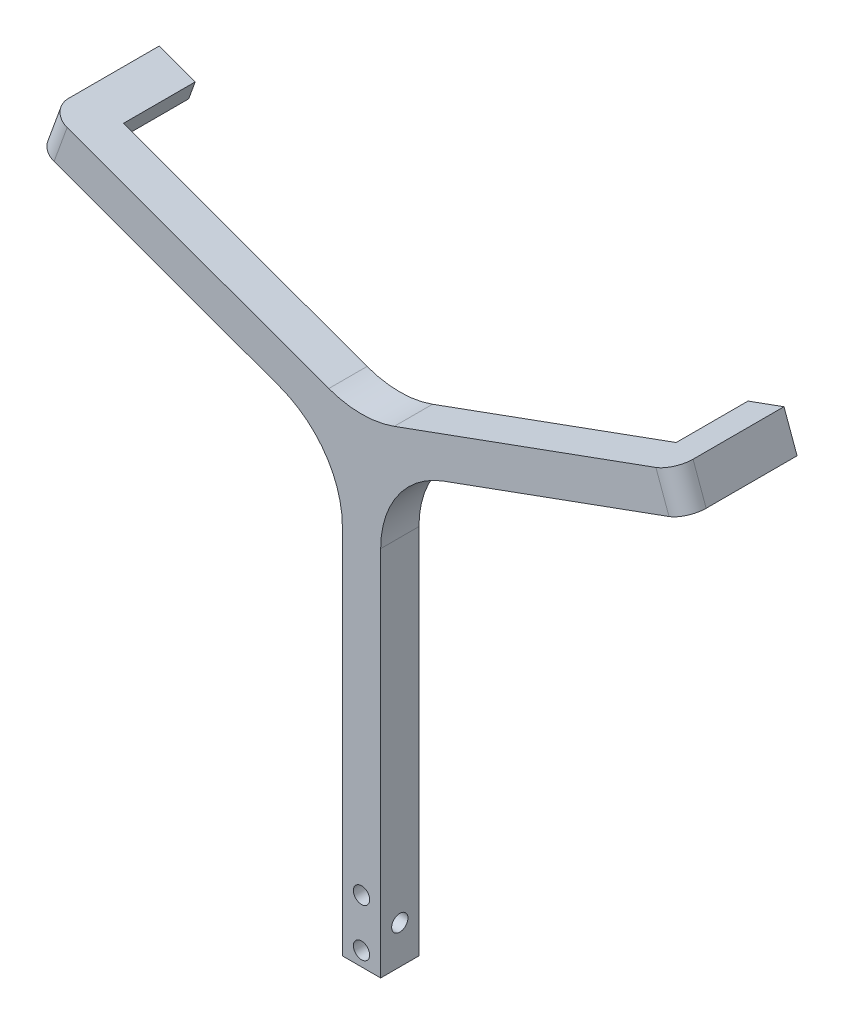
ISO-10303-21;
HEADER;
FILE_DESCRIPTION(('STEP AP214'),'2;1');
FILE_NAME('part.step','',(''),(''),'','','');
FILE_SCHEMA(('AUTOMOTIVE_DESIGN { 1 0 10303 214 1 1 1 1 }'));
ENDSEC;
DATA;
#1=APPLICATION_CONTEXT('core data for automotive mechanical design processes');
#2=APPLICATION_PROTOCOL_DEFINITION('international standard','automotive_design',2000,#1);
#3=PRODUCT_CONTEXT('',#1,'mechanical');
#4=PRODUCT('Part','Part','',(#3));
#5=PRODUCT_RELATED_PRODUCT_CATEGORY('part','',(#4));
#6=PRODUCT_DEFINITION_FORMATION('','',#4);
#7=PRODUCT_DEFINITION_CONTEXT('part definition',#1,'design');
#8=PRODUCT_DEFINITION('design','',#6,#7);
#9=PRODUCT_DEFINITION_SHAPE('','',#8);
#10=(LENGTH_UNIT() NAMED_UNIT(*) SI_UNIT(.MILLI.,.METRE.));
#11=(NAMED_UNIT(*) PLANE_ANGLE_UNIT() SI_UNIT($,.RADIAN.));
#12=(NAMED_UNIT(*) SI_UNIT($,.STERADIAN.) SOLID_ANGLE_UNIT());
#13=UNCERTAINTY_MEASURE_WITH_UNIT(LENGTH_MEASURE(1.E-05),#10,'distance_accuracy_value','');
#14=(GEOMETRIC_REPRESENTATION_CONTEXT(3) GLOBAL_UNCERTAINTY_ASSIGNED_CONTEXT((#13)) GLOBAL_UNIT_ASSIGNED_CONTEXT((#10,
#11,#12)) REPRESENTATION_CONTEXT('',''));
#15=CARTESIAN_POINT('',(0.,0.,0.));
#16=DIRECTION('',(0.,0.,1.));
#17=DIRECTION('',(1.,0.,0.));
#18=AXIS2_PLACEMENT_3D('',#15,#16,#17);
#19=CARTESIAN_POINT('',(0.,0.,0.));
#20=DIRECTION('',(0.,0.,-1.));
#21=DIRECTION('',(-1.,0.,0.));
#22=AXIS2_PLACEMENT_3D('',#19,#20,#21);
#23=PLANE('',#22);
#24=CARTESIAN_POINT('',(68.,45.5,0.));
#25=DIRECTION('',(0.,0.,-1.));
#26=DIRECTION('',(-1.,0.,0.));
#27=AXIS2_PLACEMENT_3D('',#24,#25,#26);
#28=CIRCLE('',#27,1.69999999999999);
#29=CARTESIAN_POINT('',(66.3,45.5,0.));
#30=VERTEX_POINT('',#29);
#31=EDGE_CURVE('E646',#30,#30,#28,.T.);
#32=ORIENTED_EDGE('',*,*,#31,.F.);
#33=EDGE_LOOP('',(#32));
#34=FACE_BOUND('',#33,.T.);
#35=CARTESIAN_POINT('',(68.,35.5,0.));
#36=DIRECTION('',(0.,0.,-1.));
#37=DIRECTION('',(-1.,0.,0.));
#38=AXIS2_PLACEMENT_3D('',#35,#36,#37);
#39=CIRCLE('',#38,1.69999999999999);
#40=CARTESIAN_POINT('',(66.3,35.5,0.));
#41=VERTEX_POINT('',#40);
#42=EDGE_CURVE('E652',#41,#41,#39,.T.);
#43=ORIENTED_EDGE('',*,*,#42,.F.);
#44=EDGE_LOOP('',(#43));
#45=FACE_BOUND('',#44,.T.);
#46=DIRECTION('',(0.,1.,0.));
#47=VECTOR('',#46,1.);
#48=CARTESIAN_POINT('',(72.,124.188364040676,0.));
#49=LINE('',#48,#47);
#50=CARTESIAN_POINT('',(72.,32.5,0.));
#51=VERTEX_POINT('',#50);
#52=CARTESIAN_POINT('',(72.,110.184213276482,0.));
#53=VERTEX_POINT('',#52);
#54=EDGE_CURVE('E195',#51,#53,#49,.T.);
#55=ORIENTED_EDGE('',*,*,#54,.F.);
#56=DIRECTION('',(-1.,0.,0.));
#57=VECTOR('',#56,1.);
#58=CARTESIAN_POINT('',(0.,32.5,0.));
#59=LINE('',#58,#57);
#60=CARTESIAN_POINT('',(64.,32.5,0.));
#61=VERTEX_POINT('',#60);
#62=EDGE_CURVE('E180',#51,#61,#59,.T.);
#63=ORIENTED_EDGE('',*,*,#62,.T.);
#64=DIRECTION('',(0.,-1.,0.));
#65=VECTOR('',#64,1.);
#66=CARTESIAN_POINT('',(64.,0.,0.));
#67=LINE('',#66,#65);
#68=CARTESIAN_POINT('',(64.0000000000001,110.184213276482,0.));
#69=VERTEX_POINT('',#68);
#70=EDGE_CURVE('E228',#69,#61,#67,.T.);
#71=ORIENTED_EDGE('',*,*,#70,.F.);
#72=CARTESIAN_POINT('',(44.0000000000001,110.184213276482,0.));
#73=DIRECTION('',(0.,0.,-1.));
#74=DIRECTION('',(-1.,0.,0.));
#75=AXIS2_PLACEMENT_3D('',#72,#73,#74);
#76=CIRCLE('',#75,20.);
#77=CARTESIAN_POINT('',(50.8404028665134,128.9780656922,0.));
#78=VERTEX_POINT('',#77);
#79=EDGE_CURVE('E271',#69,#78,#76,.F.);
#80=ORIENTED_EDGE('',*,*,#79,.T.);
#81=DIRECTION('',(0.939692620785909,-0.342020143325666,0.));
#82=VECTOR('',#81,1.);
#83=CARTESIAN_POINT('',(64.0000000000001,124.188364040676,0.));
#84=LINE('',#83,#82);
#85=CARTESIAN_POINT('',(3.75877048314365,146.11437846041,0.));
#86=VERTEX_POINT('',#85);
#87=EDGE_CURVE('E224',#86,#78,#84,.T.);
#88=ORIENTED_EDGE('',*,*,#87,.F.);
#89=DIRECTION('',(-0.906307787036649,-0.422618261740702,0.));
#90=VECTOR('',#89,1.);
#91=CARTESIAN_POINT('',(8.88562153958992,148.505068370251,0.));
#92=LINE('',#91,#90);
#93=CARTESIAN_POINT('',(8.88562153958992,148.505068370251,0.));
#94=VERTEX_POINT('',#93);
#95=EDGE_CURVE('E189',#94,#86,#92,.T.);
#96=ORIENTED_EDGE('',*,*,#95,.F.);
#97=DIRECTION('',(-0.342020143325668,-0.939692620785909,0.));
#98=VECTOR('',#97,1.);
#99=CARTESIAN_POINT('',(10.2537021128926,152.263838853395,0.));
#100=LINE('',#99,#98);
#101=CARTESIAN_POINT('',(10.2537021128926,152.263838853395,0.));
#102=VERTEX_POINT('',#101);
#103=EDGE_CURVE('E350',#102,#94,#100,.T.);
#104=ORIENTED_EDGE('',*,*,#103,.F.);
#105=DIRECTION('',(-0.939692620785908,0.342020143325669,0.));
#106=VECTOR('',#105,1.);
#107=CARTESIAN_POINT('',(2.73616114660533,155.,0.));
#108=LINE('',#107,#106);
#109=CARTESIAN_POINT('',(61.1595971334866,133.735608317218,0.));
#110=VERTEX_POINT('',#109);
#111=EDGE_CURVE('E221',#110,#102,#108,.T.);
#112=ORIENTED_EDGE('',*,*,#111,.F.);
#113=CARTESIAN_POINT('',(68.,152.529460732936,0.));
#114=DIRECTION('',(0.,0.,-1.));
#115=DIRECTION('',(-1.,0.,0.));
#116=AXIS2_PLACEMENT_3D('',#113,#114,#115);
#117=CIRCLE('',#116,20.);
#118=CARTESIAN_POINT('',(74.8404028665134,133.735608317218,0.));
#119=VERTEX_POINT('',#118);
#120=EDGE_CURVE('E277',#110,#119,#117,.F.);
#121=ORIENTED_EDGE('',*,*,#120,.T.);
#122=DIRECTION('',(-0.939692620785908,-0.34202014332567,0.));
#123=VECTOR('',#122,1.);
#124=CARTESIAN_POINT('',(68.,131.245905283418,0.));
#125=LINE('',#124,#123);
#126=CARTESIAN_POINT('',(125.746297887107,152.263838853395,0.));
#127=VERTEX_POINT('',#126);
#128=EDGE_CURVE('E209',#127,#119,#125,.T.);
#129=ORIENTED_EDGE('',*,*,#128,.F.);
#130=DIRECTION('',(-0.342020143325667,0.939692620785909,0.));
#131=VECTOR('',#130,1.);
#132=CARTESIAN_POINT('',(127.11437846041,148.505068370251,0.));
#133=LINE('',#132,#131);
#134=CARTESIAN_POINT('',(127.11437846041,148.505068370251,0.));
#135=VERTEX_POINT('',#134);
#136=EDGE_CURVE('E369',#135,#127,#133,.T.);
#137=ORIENTED_EDGE('',*,*,#136,.F.);
#138=DIRECTION('',(-0.906307787036652,0.422618261740695,0.));
#139=VECTOR('',#138,1.);
#140=CARTESIAN_POINT('',(132.241229516856,146.11437846041,0.));
#141=LINE('',#140,#139);
#142=CARTESIAN_POINT('',(132.241229516856,146.11437846041,0.));
#143=VERTEX_POINT('',#142);
#144=EDGE_CURVE('E363',#143,#135,#141,.T.);
#145=ORIENTED_EDGE('',*,*,#144,.F.);
#146=DIRECTION('',(0.939692620785909,0.342020143325666,0.));
#147=VECTOR('',#146,1.);
#148=CARTESIAN_POINT('',(136.,147.482459033713,0.));
#149=LINE('',#148,#147);
#150=CARTESIAN_POINT('',(85.1595971334866,128.9780656922,0.));
#151=VERTEX_POINT('',#150);
#152=EDGE_CURVE('E204',#151,#143,#149,.T.);
#153=ORIENTED_EDGE('',*,*,#152,.F.);
#154=CARTESIAN_POINT('',(92.,110.184213276482,0.));
#155=DIRECTION('',(0.,0.,-1.));
#156=DIRECTION('',(-1.,0.,0.));
#157=AXIS2_PLACEMENT_3D('',#154,#155,#156);
#158=CIRCLE('',#157,20.);
#159=EDGE_CURVE('E201',#151,#53,#158,.F.);
#160=ORIENTED_EDGE('',*,*,#159,.T.);
#161=EDGE_LOOP('',(#55,#63,#71,#80,#88,#96,#104,#112,#121,#129,#137,#145,#153,#160));
#162=FACE_BOUND('',#161,.T.);
#163=ADVANCED_FACE('F43',(#34,#45,#162),#23,.T.);
#164=CARTESIAN_POINT('',(72.,124.188364040676,8.));
#165=DIRECTION('',(-1.,0.,0.));
#166=DIRECTION('',(0.,-1.,0.));
#167=AXIS2_PLACEMENT_3D('',#164,#165,#166);
#168=PLANE('',#167);
#169=CARTESIAN_POINT('',(72.,40.5,4.));
#170=DIRECTION('',(-1.,0.,0.));
#171=DIRECTION('',(0.,-1.,0.));
#172=AXIS2_PLACEMENT_3D('',#169,#170,#171);
#173=CIRCLE('',#172,1.69999999999999);
#174=CARTESIAN_POINT('',(72.,38.8,4.));
#175=VERTEX_POINT('',#174);
#176=EDGE_CURVE('E664',#175,#175,#173,.T.);
#177=ORIENTED_EDGE('',*,*,#176,.T.);
#178=EDGE_LOOP('',(#177));
#179=FACE_BOUND('',#178,.T.);
#180=DIRECTION('',(0.,0.,1.));
#181=VECTOR('',#180,1.);
#182=CARTESIAN_POINT('',(72.,32.5,11.5));
#183=LINE('',#182,#181);
#184=CARTESIAN_POINT('',(72.,32.5,8.));
#185=VERTEX_POINT('',#184);
#186=EDGE_CURVE('E59',#51,#185,#183,.T.);
#187=ORIENTED_EDGE('',*,*,#186,.F.);
#188=ORIENTED_EDGE('',*,*,#54,.T.);
#189=DIRECTION('',(0.,0.,-1.));
#190=VECTOR('',#189,1.);
#191=CARTESIAN_POINT('',(72.,110.184213276482,8.));
#192=LINE('',#191,#190);
#193=CARTESIAN_POINT('',(72.,110.184213276482,8.));
#194=VERTEX_POINT('',#193);
#195=EDGE_CURVE('E247',#53,#194,#192,.F.);
#196=ORIENTED_EDGE('',*,*,#195,.T.);
#197=DIRECTION('',(0.,1.,0.));
#198=VECTOR('',#197,1.);
#199=CARTESIAN_POINT('',(72.,124.188364040676,8.));
#200=LINE('',#199,#198);
#201=EDGE_CURVE('E197',#185,#194,#200,.T.);
#202=ORIENTED_EDGE('',*,*,#201,.F.);
#203=EDGE_LOOP('',(#187,#188,#196,#202));
#204=FACE_BOUND('',#203,.T.);
#205=ADVANCED_FACE('F193',(#179,#204),#168,.F.);
#206=CARTESIAN_POINT('',(64.,0.,8.));
#207=DIRECTION('',(1.,0.,0.));
#208=DIRECTION('',(0.,1.,0.));
#209=AXIS2_PLACEMENT_3D('',#206,#207,#208);
#210=PLANE('',#209);
#211=CARTESIAN_POINT('',(64.,40.5,4.));
#212=DIRECTION('',(-1.,0.,0.));
#213=DIRECTION('',(0.,0.,1.));
#214=AXIS2_PLACEMENT_3D('',#211,#212,#213);
#215=CIRCLE('',#214,1.69999999999999);
#216=CARTESIAN_POINT('',(64.,40.5,5.69999999999999));
#217=VERTEX_POINT('',#216);
#218=EDGE_CURVE('E660',#217,#217,#215,.T.);
#219=ORIENTED_EDGE('',*,*,#218,.F.);
#220=EDGE_LOOP('',(#219));
#221=FACE_BOUND('',#220,.T.);
#222=DIRECTION('',(0.,0.,-1.));
#223=VECTOR('',#222,1.);
#224=CARTESIAN_POINT('',(64.,32.5,11.5));
#225=LINE('',#224,#223);
#226=CARTESIAN_POINT('',(64.,32.5,8.));
#227=VERTEX_POINT('',#226);
#228=EDGE_CURVE('E183',#227,#61,#225,.T.);
#229=ORIENTED_EDGE('',*,*,#228,.F.);
#230=DIRECTION('',(0.,-1.,0.));
#231=VECTOR('',#230,1.);
#232=CARTESIAN_POINT('',(64.,0.,8.));
#233=LINE('',#232,#231);
#234=CARTESIAN_POINT('',(64.0000000000001,110.184213276482,8.));
#235=VERTEX_POINT('',#234);
#236=EDGE_CURVE('E215',#235,#227,#233,.T.);
#237=ORIENTED_EDGE('',*,*,#236,.F.);
#238=DIRECTION('',(0.,0.,-1.));
#239=VECTOR('',#238,1.);
#240=CARTESIAN_POINT('',(64.0000000000001,110.184213276482,0.));
#241=LINE('',#240,#239);
#242=EDGE_CURVE('E250',#235,#69,#241,.T.);
#243=ORIENTED_EDGE('',*,*,#242,.T.);
#244=ORIENTED_EDGE('',*,*,#70,.T.);
#245=EDGE_LOOP('',(#229,#237,#243,#244));
#246=FACE_BOUND('',#245,.T.);
#247=ADVANCED_FACE('F409',(#221,#246),#210,.F.);
#248=CARTESIAN_POINT('',(0.,0.,8.));
#249=DIRECTION('',(0.,0.,-1.));
#250=DIRECTION('',(-1.,0.,0.));
#251=AXIS2_PLACEMENT_3D('',#248,#249,#250);
#252=PLANE('',#251);
#253=CARTESIAN_POINT('',(68.,45.5,8.));
#254=DIRECTION('',(0.,0.,-1.));
#255=DIRECTION('',(-1.,0.,0.));
#256=AXIS2_PLACEMENT_3D('',#253,#254,#255);
#257=CIRCLE('',#256,1.69999999999999);
#258=CARTESIAN_POINT('',(66.3,45.5,8.));
#259=VERTEX_POINT('',#258);
#260=EDGE_CURVE('E649',#259,#259,#257,.T.);
#261=ORIENTED_EDGE('',*,*,#260,.T.);
#262=EDGE_LOOP('',(#261));
#263=FACE_BOUND('',#262,.T.);
#264=CARTESIAN_POINT('',(68.,35.5,8.));
#265=DIRECTION('',(0.,0.,-1.));
#266=DIRECTION('',(-1.,0.,0.));
#267=AXIS2_PLACEMENT_3D('',#264,#265,#266);
#268=CIRCLE('',#267,1.69999999999999);
#269=CARTESIAN_POINT('',(66.3,35.5,8.));
#270=VERTEX_POINT('',#269);
#271=EDGE_CURVE('E47',#270,#270,#268,.T.);
#272=ORIENTED_EDGE('',*,*,#271,.T.);
#273=EDGE_LOOP('',(#272));
#274=FACE_BOUND('',#273,.T.);
#275=DIRECTION('',(-1.,0.,0.));
#276=VECTOR('',#275,1.);
#277=CARTESIAN_POINT('',(0.,32.5,8.));
#278=LINE('',#277,#276);
#279=EDGE_CURVE('E11',#185,#227,#278,.T.);
#280=ORIENTED_EDGE('',*,*,#279,.F.);
#281=ORIENTED_EDGE('',*,*,#201,.T.);
#282=CARTESIAN_POINT('',(92.,110.184213276482,8.));
#283=DIRECTION('',(0.,0.,-1.));
#284=DIRECTION('',(-1.,0.,0.));
#285=AXIS2_PLACEMENT_3D('',#282,#283,#284);
#286=CIRCLE('',#285,20.);
#287=CARTESIAN_POINT('',(85.1595971334866,128.9780656922,8.));
#288=VERTEX_POINT('',#287);
#289=EDGE_CURVE('E268',#194,#288,#286,.T.);
#290=ORIENTED_EDGE('',*,*,#289,.T.);
#291=DIRECTION('',(0.939692620785909,0.342020143325666,0.));
#292=VECTOR('',#291,1.);
#293=CARTESIAN_POINT('',(136.,147.482459033713,8.));
#294=LINE('',#293,#292);
#295=CARTESIAN_POINT('',(132.241229516856,146.11437846041,8.));
#296=VERTEX_POINT('',#295);
#297=EDGE_CURVE('E397',#288,#296,#294,.T.);
#298=ORIENTED_EDGE('',*,*,#297,.T.);
#299=DIRECTION('',(-0.342020143325668,0.939692620785909,0.));
#300=VECTOR('',#299,1.);
#301=CARTESIAN_POINT('',(163.732200305433,59.5936473020893,8.));
#302=LINE('',#301,#300);
#303=CARTESIAN_POINT('',(129.505068370251,153.631919426697,8.));
#304=VERTEX_POINT('',#303);
#305=EDGE_CURVE('E287',#296,#304,#302,.T.);
#306=ORIENTED_EDGE('',*,*,#305,.T.);
#307=DIRECTION('',(-0.939692620785908,-0.34202014332567,0.));
#308=VECTOR('',#307,1.);
#309=CARTESIAN_POINT('',(68.,131.245905283418,8.));
#310=LINE('',#309,#308);
#311=CARTESIAN_POINT('',(74.8404028665134,133.735608317218,8.));
#312=VERTEX_POINT('',#311);
#313=EDGE_CURVE('E322',#304,#312,#310,.T.);
#314=ORIENTED_EDGE('',*,*,#313,.T.);
#315=CARTESIAN_POINT('',(68.,152.529460732936,8.));
#316=DIRECTION('',(0.,0.,-1.));
#317=DIRECTION('',(-1.,0.,0.));
#318=AXIS2_PLACEMENT_3D('',#315,#316,#317);
#319=CIRCLE('',#318,20.);
#320=CARTESIAN_POINT('',(61.1595971334866,133.735608317218,8.));
#321=VERTEX_POINT('',#320);
#322=EDGE_CURVE('E280',#312,#321,#319,.T.);
#323=ORIENTED_EDGE('',*,*,#322,.T.);
#324=DIRECTION('',(-0.939692620785908,0.342020143325669,0.));
#325=VECTOR('',#324,1.);
#326=CARTESIAN_POINT('',(2.73616114660533,155.,8.));
#327=LINE('',#326,#325);
#328=CARTESIAN_POINT('',(6.49493162974896,153.631919426697,8.));
#329=VERTEX_POINT('',#328);
#330=EDGE_CURVE('E311',#321,#329,#327,.T.);
#331=ORIENTED_EDGE('',*,*,#330,.T.);
#332=DIRECTION('',(-0.342020143325666,-0.939692620785909,0.));
#333=VECTOR('',#332,1.);
#334=CARTESIAN_POINT('',(-43.6411781733426,15.8840898434045,8.));
#335=LINE('',#334,#333);
#336=CARTESIAN_POINT('',(3.75877048314362,146.11437846041,8.));
#337=VERTEX_POINT('',#336);
#338=EDGE_CURVE('E283',#329,#337,#335,.T.);
#339=ORIENTED_EDGE('',*,*,#338,.T.);
#340=DIRECTION('',(0.939692620785909,-0.342020143325666,0.));
#341=VECTOR('',#340,1.);
#342=CARTESIAN_POINT('',(64.0000000000001,124.188364040676,8.));
#343=LINE('',#342,#341);
#344=CARTESIAN_POINT('',(50.8404028665134,128.9780656922,8.));
#345=VERTEX_POINT('',#344);
#346=EDGE_CURVE('E321',#337,#345,#343,.T.);
#347=ORIENTED_EDGE('',*,*,#346,.T.);
#348=CARTESIAN_POINT('',(44.0000000000001,110.184213276482,8.));
#349=DIRECTION('',(0.,0.,-1.));
#350=DIRECTION('',(-1.,0.,0.));
#351=AXIS2_PLACEMENT_3D('',#348,#349,#350);
#352=CIRCLE('',#351,20.);
#353=EDGE_CURVE('E274',#345,#235,#352,.T.);
#354=ORIENTED_EDGE('',*,*,#353,.T.);
#355=ORIENTED_EDGE('',*,*,#236,.T.);
#356=EDGE_LOOP('',(#280,#281,#290,#298,#306,#314,#323,#331,#339,#347,#354,#355));
#357=FACE_BOUND('',#356,.T.);
#358=ADVANCED_FACE('F317',(#263,#274,#357),#252,.F.);
#359=CARTESIAN_POINT('',(136.,147.482459033713,8.));
#360=DIRECTION('',(-0.342020143325666,0.939692620785909,0.));
#361=DIRECTION('',(-0.939692620785909,-0.342020143325666,0.));
#362=AXIS2_PLACEMENT_3D('',#359,#360,#361);
#363=PLANE('',#362);
#364=DIRECTION('',(0.,0.,-1.));
#365=VECTOR('',#364,1.);
#366=CARTESIAN_POINT('',(136.,147.482459033713,8.));
#367=LINE('',#366,#365);
#368=CARTESIAN_POINT('',(136.,147.482459033713,4.));
#369=VERTEX_POINT('',#368);
#370=CARTESIAN_POINT('',(136.,147.482459033713,-15.));
#371=VERTEX_POINT('',#370);
#372=EDGE_CURVE('E240',#369,#371,#367,.T.);
#373=ORIENTED_EDGE('',*,*,#372,.F.);
#374=CARTESIAN_POINT('',(132.241229516856,146.11437846041,4.));
#375=DIRECTION('',(-0.342020143325666,0.939692620785909,0.));
#376=DIRECTION('',(-0.939692620785909,-0.342020143325666,0.));
#377=AXIS2_PLACEMENT_3D('',#374,#375,#376);
#378=CIRCLE('',#377,4.);
#379=EDGE_CURVE('E297',#369,#296,#378,.F.);
#380=ORIENTED_EDGE('',*,*,#379,.T.);
#381=ORIENTED_EDGE('',*,*,#297,.F.);
#382=DIRECTION('',(0.,0.,-1.));
#383=VECTOR('',#382,1.);
#384=CARTESIAN_POINT('',(85.1595971334866,128.9780656922,0.));
#385=LINE('',#384,#383);
#386=EDGE_CURVE('E243',#288,#151,#385,.T.);
#387=ORIENTED_EDGE('',*,*,#386,.T.);
#388=ORIENTED_EDGE('',*,*,#152,.T.);
#389=DIRECTION('',(0.,0.,1.));
#390=VECTOR('',#389,1.);
#391=CARTESIAN_POINT('',(132.241229516856,146.11437846041,-15.));
#392=LINE('',#391,#390);
#393=CARTESIAN_POINT('',(132.241229516856,146.11437846041,-15.));
#394=VERTEX_POINT('',#393);
#395=EDGE_CURVE('E205',#394,#143,#392,.T.);
#396=ORIENTED_EDGE('',*,*,#395,.F.);
#397=DIRECTION('',(-0.939692620785908,-0.342020143325669,0.));
#398=VECTOR('',#397,1.);
#399=CARTESIAN_POINT('',(132.241229516856,146.11437846041,-15.));
#400=LINE('',#399,#398);
#401=EDGE_CURVE('E368',#371,#394,#400,.T.);
#402=ORIENTED_EDGE('',*,*,#401,.F.);
#403=EDGE_LOOP('',(#373,#380,#381,#387,#388,#396,#402));
#404=FACE_BOUND('',#403,.T.);
#405=ADVANCED_FACE('F447',(#404),#363,.F.);
#406=CARTESIAN_POINT('',(133.263838853395,155.,8.));
#407=DIRECTION('',(-0.939692620785909,-0.342020143325668,0.));
#408=DIRECTION('',(0.342020143325668,-0.939692620785909,0.));
#409=AXIS2_PLACEMENT_3D('',#406,#407,#408);
#410=PLANE('',#409);
#411=DIRECTION('',(0.,0.,-1.));
#412=VECTOR('',#411,1.);
#413=CARTESIAN_POINT('',(133.263838853395,155.,8.));
#414=LINE('',#413,#412);
#415=CARTESIAN_POINT('',(133.263838853395,155.,4.));
#416=VERTEX_POINT('',#415);
#417=CARTESIAN_POINT('',(133.263838853395,155.,-15.));
#418=VERTEX_POINT('',#417);
#419=EDGE_CURVE('E237',#416,#418,#414,.T.);
#420=ORIENTED_EDGE('',*,*,#419,.F.);
#421=DIRECTION('',(-0.342020143325668,0.939692620785909,0.));
#422=VECTOR('',#421,1.);
#423=CARTESIAN_POINT('',(133.263838853395,155.,4.));
#424=LINE('',#423,#422);
#425=EDGE_CURVE('E294',#416,#369,#424,.F.);
#426=ORIENTED_EDGE('',*,*,#425,.T.);
#427=ORIENTED_EDGE('',*,*,#372,.T.);
#428=DIRECTION('',(0.342020143325668,-0.939692620785909,0.));
#429=VECTOR('',#428,1.);
#430=CARTESIAN_POINT('',(136.,147.482459033713,-15.));
#431=LINE('',#430,#429);
#432=EDGE_CURVE('E364',#418,#371,#431,.T.);
#433=ORIENTED_EDGE('',*,*,#432,.F.);
#434=EDGE_LOOP('',(#420,#426,#427,#433));
#435=FACE_BOUND('',#434,.T.);
#436=ADVANCED_FACE('F461',(#435),#410,.F.);
#437=CARTESIAN_POINT('',(68.,131.245905283418,8.));
#438=DIRECTION('',(0.342020143325669,-0.939692620785908,0.));
#439=DIRECTION('',(0.939692620785908,0.34202014332567,0.));
#440=AXIS2_PLACEMENT_3D('',#437,#438,#439);
#441=PLANE('',#440);
#442=ORIENTED_EDGE('',*,*,#313,.F.);
#443=CARTESIAN_POINT('',(129.505068370251,153.631919426697,4.));
#444=DIRECTION('',(0.342020143325669,-0.939692620785908,0.));
#445=DIRECTION('',(0.939692620785908,0.34202014332567,0.));
#446=AXIS2_PLACEMENT_3D('',#443,#444,#445);
#447=CIRCLE('',#446,4.);
#448=EDGE_CURVE('E291',#304,#416,#447,.F.);
#449=ORIENTED_EDGE('',*,*,#448,.T.);
#450=ORIENTED_EDGE('',*,*,#419,.T.);
#451=DIRECTION('',(0.939692620785907,0.342020143325672,0.));
#452=VECTOR('',#451,1.);
#453=CARTESIAN_POINT('',(133.263838853395,155.,-15.));
#454=LINE('',#453,#452);
#455=CARTESIAN_POINT('',(125.746297887107,152.263838853395,-15.));
#456=VERTEX_POINT('',#455);
#457=EDGE_CURVE('E378',#456,#418,#454,.T.);
#458=ORIENTED_EDGE('',*,*,#457,.F.);
#459=DIRECTION('',(0.,0.,1.));
#460=VECTOR('',#459,1.);
#461=CARTESIAN_POINT('',(125.746297887107,152.263838853395,-15.));
#462=LINE('',#461,#460);
#463=EDGE_CURVE('E382',#456,#127,#462,.T.);
#464=ORIENTED_EDGE('',*,*,#463,.T.);
#465=ORIENTED_EDGE('',*,*,#128,.T.);
#466=DIRECTION('',(0.,0.,-1.));
#467=VECTOR('',#466,1.);
#468=CARTESIAN_POINT('',(74.8404028665134,133.735608317218,8.));
#469=LINE('',#468,#467);
#470=EDGE_CURVE('E262',#119,#312,#469,.F.);
#471=ORIENTED_EDGE('',*,*,#470,.T.);
#472=EDGE_LOOP('',(#442,#449,#450,#458,#464,#465,#471));
#473=FACE_BOUND('',#472,.T.);
#474=ADVANCED_FACE('F432',(#473),#441,.F.);
#475=CARTESIAN_POINT('',(2.73616114660533,155.,8.));
#476=DIRECTION('',(-0.342020143325669,-0.939692620785908,0.));
#477=DIRECTION('',(0.939692620785908,-0.342020143325669,0.));
#478=AXIS2_PLACEMENT_3D('',#475,#476,#477);
#479=PLANE('',#478);
#480=DIRECTION('',(0.,0.,-1.));
#481=VECTOR('',#480,1.);
#482=CARTESIAN_POINT('',(2.73616114660533,155.,8.));
#483=LINE('',#482,#481);
#484=CARTESIAN_POINT('',(2.73616114660533,155.,4.));
#485=VERTEX_POINT('',#484);
#486=CARTESIAN_POINT('',(2.73616114660533,155.,-15.));
#487=VERTEX_POINT('',#486);
#488=EDGE_CURVE('E234',#485,#487,#483,.T.);
#489=ORIENTED_EDGE('',*,*,#488,.F.);
#490=CARTESIAN_POINT('',(6.49493162974896,153.631919426697,4.));
#491=DIRECTION('',(-0.342020143325669,-0.939692620785908,0.));
#492=DIRECTION('',(0.939692620785908,-0.342020143325669,0.));
#493=AXIS2_PLACEMENT_3D('',#490,#491,#492);
#494=CIRCLE('',#493,4.);
#495=EDGE_CURVE('E53',#485,#329,#494,.F.);
#496=ORIENTED_EDGE('',*,*,#495,.T.);
#497=ORIENTED_EDGE('',*,*,#330,.F.);
#498=DIRECTION('',(0.,0.,-1.));
#499=VECTOR('',#498,1.);
#500=CARTESIAN_POINT('',(61.1595971334866,133.735608317218,0.));
#501=LINE('',#500,#499);
#502=EDGE_CURVE('E258',#321,#110,#501,.T.);
#503=ORIENTED_EDGE('',*,*,#502,.T.);
#504=ORIENTED_EDGE('',*,*,#111,.T.);
#505=DIRECTION('',(0.,0.,1.));
#506=VECTOR('',#505,1.);
#507=CARTESIAN_POINT('',(10.2537021128926,152.263838853395,-15.));
#508=LINE('',#507,#506);
#509=CARTESIAN_POINT('',(10.2537021128926,152.263838853395,-15.));
#510=VERTEX_POINT('',#509);
#511=EDGE_CURVE('E356',#510,#102,#508,.T.);
#512=ORIENTED_EDGE('',*,*,#511,.F.);
#513=DIRECTION('',(0.939692620785908,-0.342020143325669,0.));
#514=VECTOR('',#513,1.);
#515=CARTESIAN_POINT('',(10.2537021128926,152.263838853395,-15.));
#516=LINE('',#515,#514);
#517=EDGE_CURVE('E333',#487,#510,#516,.T.);
#518=ORIENTED_EDGE('',*,*,#517,.F.);
#519=EDGE_LOOP('',(#489,#496,#497,#503,#504,#512,#518));
#520=FACE_BOUND('',#519,.T.);
#521=ADVANCED_FACE('F310',(#520),#479,.F.);
#522=CARTESIAN_POINT('',(0.,147.482459033713,8.));
#523=DIRECTION('',(0.939692620785909,-0.342020143325666,0.));
#524=DIRECTION('',(0.342020143325666,0.939692620785909,0.));
#525=AXIS2_PLACEMENT_3D('',#522,#523,#524);
#526=PLANE('',#525);
#527=DIRECTION('',(0.,0.,-1.));
#528=VECTOR('',#527,1.);
#529=CARTESIAN_POINT('',(0.,147.482459033713,8.));
#530=LINE('',#529,#528);
#531=CARTESIAN_POINT('',(0.,147.482459033713,4.));
#532=VERTEX_POINT('',#531);
#533=CARTESIAN_POINT('',(0.,147.482459033713,-15.));
#534=VERTEX_POINT('',#533);
#535=EDGE_CURVE('E231',#532,#534,#530,.T.);
#536=ORIENTED_EDGE('',*,*,#535,.F.);
#537=DIRECTION('',(-0.342020143325666,-0.939692620785909,0.));
#538=VECTOR('',#537,1.);
#539=CARTESIAN_POINT('',(0.,147.482459033713,4.));
#540=LINE('',#539,#538);
#541=EDGE_CURVE('E67',#532,#485,#540,.F.);
#542=ORIENTED_EDGE('',*,*,#541,.T.);
#543=ORIENTED_EDGE('',*,*,#488,.T.);
#544=DIRECTION('',(0.342020143325666,0.939692620785909,0.));
#545=VECTOR('',#544,1.);
#546=CARTESIAN_POINT('',(2.73616114660533,155.,-15.));
#547=LINE('',#546,#545);
#548=EDGE_CURVE('E330',#534,#487,#547,.T.);
#549=ORIENTED_EDGE('',*,*,#548,.F.);
#550=EDGE_LOOP('',(#536,#542,#543,#549));
#551=FACE_BOUND('',#550,.T.);
#552=ADVANCED_FACE('F328',(#551),#526,.F.);
#553=CARTESIAN_POINT('',(64.0000000000001,124.188364040676,8.));
#554=DIRECTION('',(0.342020143325666,0.939692620785909,0.));
#555=DIRECTION('',(-0.939692620785909,0.342020143325666,0.));
#556=AXIS2_PLACEMENT_3D('',#553,#554,#555);
#557=PLANE('',#556);
#558=ORIENTED_EDGE('',*,*,#346,.F.);
#559=CARTESIAN_POINT('',(3.75877048314364,146.11437846041,4.));
#560=DIRECTION('',(0.342020143325666,0.939692620785909,0.));
#561=DIRECTION('',(-0.939692620785909,0.342020143325666,0.));
#562=AXIS2_PLACEMENT_3D('',#559,#560,#561);
#563=CIRCLE('',#562,4.);
#564=EDGE_CURVE('E300',#337,#532,#563,.F.);
#565=ORIENTED_EDGE('',*,*,#564,.T.);
#566=ORIENTED_EDGE('',*,*,#535,.T.);
#567=DIRECTION('',(-0.939692620785909,0.342020143325668,0.));
#568=VECTOR('',#567,1.);
#569=CARTESIAN_POINT('',(0.,147.482459033713,-15.));
#570=LINE('',#569,#568);
#571=CARTESIAN_POINT('',(3.75877048314365,146.11437846041,-15.));
#572=VERTEX_POINT('',#571);
#573=EDGE_CURVE('E334',#572,#534,#570,.T.);
#574=ORIENTED_EDGE('',*,*,#573,.F.);
#575=DIRECTION('',(0.,0.,1.));
#576=VECTOR('',#575,1.);
#577=CARTESIAN_POINT('',(3.75877048314365,146.11437846041,-15.));
#578=LINE('',#577,#576);
#579=EDGE_CURVE('E360',#572,#86,#578,.T.);
#580=ORIENTED_EDGE('',*,*,#579,.T.);
#581=ORIENTED_EDGE('',*,*,#87,.T.);
#582=DIRECTION('',(0.,0.,-1.));
#583=VECTOR('',#582,1.);
#584=CARTESIAN_POINT('',(50.8404028665134,128.9780656922,8.));
#585=LINE('',#584,#583);
#586=EDGE_CURVE('E254',#78,#345,#585,.F.);
#587=ORIENTED_EDGE('',*,*,#586,.T.);
#588=EDGE_LOOP('',(#558,#565,#566,#574,#580,#581,#587));
#589=FACE_BOUND('',#588,.T.);
#590=ADVANCED_FACE('F325',(#589),#557,.F.);
#591=CARTESIAN_POINT('',(132.241229516856,146.11437846041,-15.));
#592=DIRECTION('',(0.422618261740695,0.906307787036652,0.));
#593=DIRECTION('',(-0.906307787036652,0.422618261740695,0.));
#594=AXIS2_PLACEMENT_3D('',#591,#592,#593);
#595=PLANE('',#594);
#596=ORIENTED_EDGE('',*,*,#144,.T.);
#597=DIRECTION('',(0.,0.,1.));
#598=VECTOR('',#597,1.);
#599=CARTESIAN_POINT('',(127.11437846041,148.505068370251,-15.));
#600=LINE('',#599,#598);
#601=CARTESIAN_POINT('',(127.11437846041,148.505068370251,-15.));
#602=VERTEX_POINT('',#601);
#603=EDGE_CURVE('E212',#602,#135,#600,.T.);
#604=ORIENTED_EDGE('',*,*,#603,.F.);
#605=DIRECTION('',(-0.906307787036652,0.422618261740695,0.));
#606=VECTOR('',#605,1.);
#607=CARTESIAN_POINT('',(132.241229516856,146.11437846041,-15.));
#608=LINE('',#607,#606);
#609=EDGE_CURVE('E372',#394,#602,#608,.T.);
#610=ORIENTED_EDGE('',*,*,#609,.F.);
#611=ORIENTED_EDGE('',*,*,#395,.T.);
#612=EDGE_LOOP('',(#596,#604,#610,#611));
#613=FACE_BOUND('',#612,.T.);
#614=ADVANCED_FACE('F441',(#613),#595,.F.);
#615=CARTESIAN_POINT('',(127.11437846041,148.505068370251,-15.));
#616=DIRECTION('',(0.939692620785909,0.342020143325667,0.));
#617=DIRECTION('',(-0.342020143325667,0.939692620785909,0.));
#618=AXIS2_PLACEMENT_3D('',#615,#616,#617);
#619=PLANE('',#618);
#620=ORIENTED_EDGE('',*,*,#136,.T.);
#621=ORIENTED_EDGE('',*,*,#463,.F.);
#622=DIRECTION('',(-0.342020143325667,0.939692620785909,0.));
#623=VECTOR('',#622,1.);
#624=CARTESIAN_POINT('',(127.11437846041,148.505068370251,-15.));
#625=LINE('',#624,#623);
#626=EDGE_CURVE('E375',#602,#456,#625,.T.);
#627=ORIENTED_EDGE('',*,*,#626,.F.);
#628=ORIENTED_EDGE('',*,*,#603,.T.);
#629=EDGE_LOOP('',(#620,#621,#627,#628));
#630=FACE_BOUND('',#629,.T.);
#631=ADVANCED_FACE('F437',(#630),#619,.F.);
#632=CARTESIAN_POINT('',(0.,0.,-15.));
#633=DIRECTION('',(0.,0.,1.));
#634=DIRECTION('',(1.,0.,0.));
#635=AXIS2_PLACEMENT_3D('',#632,#633,#634);
#636=PLANE('',#635);
#637=ORIENTED_EDGE('',*,*,#432,.T.);
#638=ORIENTED_EDGE('',*,*,#401,.T.);
#639=ORIENTED_EDGE('',*,*,#609,.T.);
#640=ORIENTED_EDGE('',*,*,#626,.T.);
#641=ORIENTED_EDGE('',*,*,#457,.T.);
#642=EDGE_LOOP('',(#637,#638,#639,#640,#641));
#643=FACE_BOUND('',#642,.T.);
#644=ADVANCED_FACE('F463',(#643),#636,.F.);
#645=CARTESIAN_POINT('',(8.88562153958992,148.505068370251,-15.));
#646=DIRECTION('',(-0.422618261740702,0.906307787036649,0.));
#647=DIRECTION('',(-0.906307787036649,-0.422618261740702,0.));
#648=AXIS2_PLACEMENT_3D('',#645,#646,#647);
#649=PLANE('',#648);
#650=ORIENTED_EDGE('',*,*,#95,.T.);
#651=ORIENTED_EDGE('',*,*,#579,.F.);
#652=DIRECTION('',(-0.906307787036649,-0.422618261740702,0.));
#653=VECTOR('',#652,1.);
#654=CARTESIAN_POINT('',(8.88562153958992,148.505068370251,-15.));
#655=LINE('',#654,#653);
#656=CARTESIAN_POINT('',(8.88562153958992,148.505068370251,-15.));
#657=VERTEX_POINT('',#656);
#658=EDGE_CURVE('E340',#657,#572,#655,.T.);
#659=ORIENTED_EDGE('',*,*,#658,.F.);
#660=DIRECTION('',(0.,0.,1.));
#661=VECTOR('',#660,1.);
#662=CARTESIAN_POINT('',(8.88562153958992,148.505068370251,-15.));
#663=LINE('',#662,#661);
#664=EDGE_CURVE('E346',#657,#94,#663,.T.);
#665=ORIENTED_EDGE('',*,*,#664,.T.);
#666=EDGE_LOOP('',(#650,#651,#659,#665));
#667=FACE_BOUND('',#666,.T.);
#668=ADVANCED_FACE('F419',(#667),#649,.F.);
#669=CARTESIAN_POINT('',(10.2537021128926,152.263838853395,-15.));
#670=DIRECTION('',(-0.939692620785909,0.342020143325668,0.));
#671=DIRECTION('',(-0.342020143325668,-0.939692620785909,0.));
#672=AXIS2_PLACEMENT_3D('',#669,#670,#671);
#673=PLANE('',#672);
#674=ORIENTED_EDGE('',*,*,#103,.T.);
#675=ORIENTED_EDGE('',*,*,#664,.F.);
#676=DIRECTION('',(-0.342020143325668,-0.939692620785909,0.));
#677=VECTOR('',#676,1.);
#678=CARTESIAN_POINT('',(10.2537021128926,152.263838853395,-15.));
#679=LINE('',#678,#677);
#680=EDGE_CURVE('E338',#510,#657,#679,.T.);
#681=ORIENTED_EDGE('',*,*,#680,.F.);
#682=ORIENTED_EDGE('',*,*,#511,.T.);
#683=EDGE_LOOP('',(#674,#675,#681,#682));
#684=FACE_BOUND('',#683,.T.);
#685=ADVANCED_FACE('F424',(#684),#673,.F.);
#686=CARTESIAN_POINT('',(0.,0.,-15.));
#687=DIRECTION('',(0.,0.,1.));
#688=DIRECTION('',(1.,0.,0.));
#689=AXIS2_PLACEMENT_3D('',#686,#687,#688);
#690=PLANE('',#689);
#691=ORIENTED_EDGE('',*,*,#658,.T.);
#692=ORIENTED_EDGE('',*,*,#573,.T.);
#693=ORIENTED_EDGE('',*,*,#548,.T.);
#694=ORIENTED_EDGE('',*,*,#517,.T.);
#695=ORIENTED_EDGE('',*,*,#680,.T.);
#696=EDGE_LOOP('',(#691,#692,#693,#694,#695));
#697=FACE_BOUND('',#696,.T.);
#698=ADVANCED_FACE('F504',(#697),#690,.F.);
#699=CARTESIAN_POINT('',(92.,110.184213276482,8.));
#700=DIRECTION('',(0.,0.,1.));
#701=DIRECTION('',(1.,0.,0.));
#702=AXIS2_PLACEMENT_3D('',#699,#700,#701);
#703=CYLINDRICAL_SURFACE('',#702,20.);
#704=ORIENTED_EDGE('',*,*,#289,.F.);
#705=ORIENTED_EDGE('',*,*,#195,.F.);
#706=ORIENTED_EDGE('',*,*,#159,.F.);
#707=ORIENTED_EDGE('',*,*,#386,.F.);
#708=EDGE_LOOP('',(#704,#705,#706,#707));
#709=FACE_BOUND('',#708,.T.);
#710=ADVANCED_FACE('F452',(#709),#703,.F.);
#711=CARTESIAN_POINT('',(44.0000000000001,110.184213276482,8.));
#712=DIRECTION('',(0.,0.,1.));
#713=DIRECTION('',(1.,0.,0.));
#714=AXIS2_PLACEMENT_3D('',#711,#712,#713);
#715=CYLINDRICAL_SURFACE('',#714,20.);
#716=ORIENTED_EDGE('',*,*,#353,.F.);
#717=ORIENTED_EDGE('',*,*,#586,.F.);
#718=ORIENTED_EDGE('',*,*,#79,.F.);
#719=ORIENTED_EDGE('',*,*,#242,.F.);
#720=EDGE_LOOP('',(#716,#717,#718,#719));
#721=FACE_BOUND('',#720,.T.);
#722=ADVANCED_FACE('F411',(#721),#715,.F.);
#723=CARTESIAN_POINT('',(68.,152.529460732936,8.));
#724=DIRECTION('',(0.,0.,1.));
#725=DIRECTION('',(1.,0.,0.));
#726=AXIS2_PLACEMENT_3D('',#723,#724,#725);
#727=CYLINDRICAL_SURFACE('',#726,20.);
#728=ORIENTED_EDGE('',*,*,#322,.F.);
#729=ORIENTED_EDGE('',*,*,#470,.F.);
#730=ORIENTED_EDGE('',*,*,#120,.F.);
#731=ORIENTED_EDGE('',*,*,#502,.F.);
#732=EDGE_LOOP('',(#728,#729,#730,#731));
#733=FACE_BOUND('',#732,.T.);
#734=ADVANCED_FACE('F428',(#733),#727,.F.);
#735=CARTESIAN_POINT('',(163.732200305433,59.5936473020893,4.));
#736=DIRECTION('',(-0.342020143325668,0.939692620785909,0.));
#737=DIRECTION('',(-0.939692620785909,-0.342020143325668,0.));
#738=AXIS2_PLACEMENT_3D('',#735,#736,#737);
#739=CYLINDRICAL_SURFACE('',#738,4.);
#740=ORIENTED_EDGE('',*,*,#379,.F.);
#741=ORIENTED_EDGE('',*,*,#425,.F.);
#742=ORIENTED_EDGE('',*,*,#448,.F.);
#743=ORIENTED_EDGE('',*,*,#305,.F.);
#744=EDGE_LOOP('',(#740,#741,#742,#743));
#745=FACE_BOUND('',#744,.T.);
#746=ADVANCED_FACE('F456',(#745),#739,.T.);
#747=CARTESIAN_POINT('',(-43.6411781733426,15.8840898434045,4.));
#748=DIRECTION('',(-0.342020143325666,-0.939692620785909,0.));
#749=DIRECTION('',(0.939692620785909,-0.342020143325666,0.));
#750=AXIS2_PLACEMENT_3D('',#747,#748,#749);
#751=CYLINDRICAL_SURFACE('',#750,4.);
#752=ORIENTED_EDGE('',*,*,#495,.F.);
#753=ORIENTED_EDGE('',*,*,#541,.F.);
#754=ORIENTED_EDGE('',*,*,#564,.F.);
#755=ORIENTED_EDGE('',*,*,#338,.F.);
#756=EDGE_LOOP('',(#752,#753,#754,#755));
#757=FACE_BOUND('',#756,.T.);
#758=ADVANCED_FACE('F45',(#757),#751,.T.);
#759=CARTESIAN_POINT('',(0.,32.5,0.));
#760=DIRECTION('',(0.,-1.,0.));
#761=DIRECTION('',(0.,0.,-1.));
#762=AXIS2_PLACEMENT_3D('',#759,#760,#761);
#763=PLANE('',#762);
#764=ORIENTED_EDGE('',*,*,#186,.T.);
#765=ORIENTED_EDGE('',*,*,#279,.T.);
#766=ORIENTED_EDGE('',*,*,#228,.T.);
#767=ORIENTED_EDGE('',*,*,#62,.F.);
#768=EDGE_LOOP('',(#764,#765,#766,#767));
#769=FACE_BOUND('',#768,.T.);
#770=ADVANCED_FACE('F181',(#769),#763,.T.);
#771=CARTESIAN_POINT('',(64.,40.5,4.));
#772=DIRECTION('',(-1.,0.,0.));
#773=DIRECTION('',(0.,0.,1.));
#774=AXIS2_PLACEMENT_3D('',#771,#772,#773);
#775=CYLINDRICAL_SURFACE('',#774,1.69999999999999);
#776=ORIENTED_EDGE('',*,*,#218,.T.);
#777=EDGE_LOOP('',(#776));
#778=FACE_BOUND('',#777,.T.);
#779=ORIENTED_EDGE('',*,*,#176,.F.);
#780=EDGE_LOOP('',(#779));
#781=FACE_BOUND('',#780,.T.);
#782=ADVANCED_FACE('F516',(#778,#781),#775,.F.);
#783=CARTESIAN_POINT('',(68.,35.5,0.));
#784=DIRECTION('',(0.,0.,-1.));
#785=DIRECTION('',(-1.,0.,0.));
#786=AXIS2_PLACEMENT_3D('',#783,#784,#785);
#787=CYLINDRICAL_SURFACE('',#786,1.69999999999999);
#788=ORIENTED_EDGE('',*,*,#42,.T.);
#789=EDGE_LOOP('',(#788));
#790=FACE_BOUND('',#789,.T.);
#791=ORIENTED_EDGE('',*,*,#271,.F.);
#792=EDGE_LOOP('',(#791));
#793=FACE_BOUND('',#792,.T.);
#794=ADVANCED_FACE('F522',(#790,#793),#787,.F.);
#795=CARTESIAN_POINT('',(68.,45.5,0.));
#796=DIRECTION('',(0.,0.,-1.));
#797=DIRECTION('',(-1.,0.,0.));
#798=AXIS2_PLACEMENT_3D('',#795,#796,#797);
#799=CYLINDRICAL_SURFACE('',#798,1.69999999999999);
#800=ORIENTED_EDGE('',*,*,#31,.T.);
#801=EDGE_LOOP('',(#800));
#802=FACE_BOUND('',#801,.T.);
#803=ORIENTED_EDGE('',*,*,#260,.F.);
#804=EDGE_LOOP('',(#803));
#805=FACE_BOUND('',#804,.T.);
#806=ADVANCED_FACE('F631',(#802,#805),#799,.F.);
#807=CLOSED_SHELL('',(#163,#205,#247,#358,#405,#436,#474,#521,#552,#590,#614,#631,#644,#668,
#685,#698,#710,#722,#734,#746,#758,#770,#782,#794,#806));
#808=MANIFOLD_SOLID_BREP('B2',#807);
#809=ADVANCED_BREP_SHAPE_REPRESENTATION('',(#18,#808),#14);
#810=SHAPE_DEFINITION_REPRESENTATION(#9,#809);
ENDSEC;
END-ISO-10303-21;
